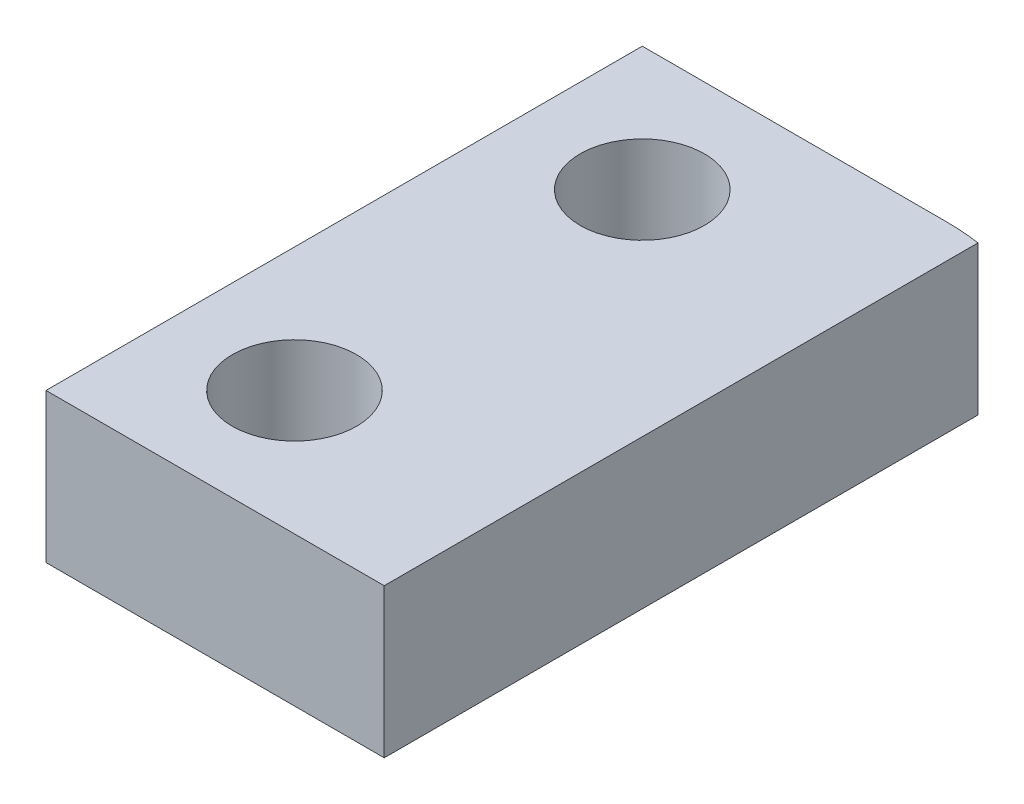
ISO-10303-21;
HEADER;
FILE_DESCRIPTION(('STEP AP214'),'2;1');
FILE_NAME('part.step','',(''),(''),'','','');
FILE_SCHEMA(('AUTOMOTIVE_DESIGN { 1 0 10303 214 1 1 1 1 }'));
ENDSEC;
DATA;
#1=APPLICATION_CONTEXT('core data for automotive mechanical design processes');
#2=APPLICATION_PROTOCOL_DEFINITION('international standard','automotive_design',2000,#1);
#3=PRODUCT_CONTEXT('',#1,'mechanical');
#4=PRODUCT('Part','Part','',(#3));
#5=PRODUCT_RELATED_PRODUCT_CATEGORY('part','',(#4));
#6=PRODUCT_DEFINITION_FORMATION('','',#4);
#7=PRODUCT_DEFINITION_CONTEXT('part definition',#1,'design');
#8=PRODUCT_DEFINITION('design','',#6,#7);
#9=PRODUCT_DEFINITION_SHAPE('','',#8);
#10=(LENGTH_UNIT() NAMED_UNIT(*) SI_UNIT(.MILLI.,.METRE.));
#11=(NAMED_UNIT(*) PLANE_ANGLE_UNIT() SI_UNIT($,.RADIAN.));
#12=(NAMED_UNIT(*) SI_UNIT($,.STERADIAN.) SOLID_ANGLE_UNIT());
#13=UNCERTAINTY_MEASURE_WITH_UNIT(LENGTH_MEASURE(1.E-05),#10,'distance_accuracy_value','');
#14=(GEOMETRIC_REPRESENTATION_CONTEXT(3) GLOBAL_UNCERTAINTY_ASSIGNED_CONTEXT((#13)) GLOBAL_UNIT_ASSIGNED_CONTEXT((#10,
#11,#12)) REPRESENTATION_CONTEXT('',''));
#15=CARTESIAN_POINT('',(0.,0.,0.));
#16=DIRECTION('',(0.,0.,1.));
#17=DIRECTION('',(1.,0.,0.));
#18=AXIS2_PLACEMENT_3D('',#15,#16,#17);
#19=CARTESIAN_POINT('',(20.,3.,6.));
#20=DIRECTION('',(0.,0.,-1.));
#21=DIRECTION('',(-1.,0.,0.));
#22=AXIS2_PLACEMENT_3D('',#19,#20,#21);
#23=PLANE('',#22);
#24=DIRECTION('',(1.,0.,0.));
#25=VECTOR('',#24,1.);
#26=CARTESIAN_POINT('',(20.,0.,6.));
#27=LINE('',#26,#25);
#28=CARTESIAN_POINT('',(-20.,0.,6.));
#29=VERTEX_POINT('',#28);
#30=CARTESIAN_POINT('',(-13.193669780394,0.,6.));
#31=VERTEX_POINT('',#30);
#32=EDGE_CURVE('E122',#29,#31,#27,.T.);
#33=ORIENTED_EDGE('',*,*,#32,.T.);
#34=DIRECTION('',(0.,1.,0.));
#35=VECTOR('',#34,1.);
#36=CARTESIAN_POINT('',(-13.193669780394,3.,6.));
#37=LINE('',#36,#35);
#38=CARTESIAN_POINT('',(-13.193669780394,3.,6.));
#39=VERTEX_POINT('',#38);
#40=EDGE_CURVE('E155',#31,#39,#37,.T.);
#41=ORIENTED_EDGE('',*,*,#40,.T.);
#42=DIRECTION('',(1.,0.,0.));
#43=VECTOR('',#42,1.);
#44=CARTESIAN_POINT('',(20.,3.,6.));
#45=LINE('',#44,#43);
#46=CARTESIAN_POINT('',(-20.,3.,6.));
#47=VERTEX_POINT('',#46);
#48=EDGE_CURVE('E97',#47,#39,#45,.T.);
#49=ORIENTED_EDGE('',*,*,#48,.F.);
#50=DIRECTION('',(0.,-1.,0.));
#51=VECTOR('',#50,1.);
#52=CARTESIAN_POINT('',(-20.,3.,6.));
#53=LINE('',#52,#51);
#54=EDGE_CURVE('E101',#47,#29,#53,.T.);
#55=ORIENTED_EDGE('',*,*,#54,.T.);
#56=EDGE_LOOP('',(#33,#41,#49,#55));
#57=FACE_BOUND('',#56,.T.);
#58=ADVANCED_FACE('F38',(#57),#23,.F.);
#59=CARTESIAN_POINT('',(-20.,3.,6.));
#60=DIRECTION('',(1.,0.,0.));
#61=DIRECTION('',(0.,0.,-1.));
#62=AXIS2_PLACEMENT_3D('',#59,#60,#61);
#63=PLANE('',#62);
#64=DIRECTION('',(0.,0.,1.));
#65=VECTOR('',#64,1.);
#66=CARTESIAN_POINT('',(-20.,0.,6.));
#67=LINE('',#66,#65);
#68=CARTESIAN_POINT('',(-20.,0.,-6.));
#69=VERTEX_POINT('',#68);
#70=EDGE_CURVE('E117',#69,#29,#67,.T.);
#71=ORIENTED_EDGE('',*,*,#70,.T.);
#72=ORIENTED_EDGE('',*,*,#54,.F.);
#73=DIRECTION('',(0.,0.,1.));
#74=VECTOR('',#73,1.);
#75=CARTESIAN_POINT('',(-20.,3.,6.));
#76=LINE('',#75,#74);
#77=CARTESIAN_POINT('',(-20.,3.,-6.));
#78=VERTEX_POINT('',#77);
#79=EDGE_CURVE('E121',#78,#47,#76,.T.);
#80=ORIENTED_EDGE('',*,*,#79,.F.);
#81=DIRECTION('',(0.,-1.,0.));
#82=VECTOR('',#81,1.);
#83=CARTESIAN_POINT('',(-20.,3.,-6.));
#84=LINE('',#83,#82);
#85=EDGE_CURVE('E107',#78,#69,#84,.T.);
#86=ORIENTED_EDGE('',*,*,#85,.T.);
#87=EDGE_LOOP('',(#71,#72,#80,#86));
#88=FACE_BOUND('',#87,.T.);
#89=ADVANCED_FACE('F163',(#88),#63,.F.);
#90=CARTESIAN_POINT('',(20.,3.,-6.));
#91=DIRECTION('',(0.,0.,1.));
#92=DIRECTION('',(1.,0.,0.));
#93=AXIS2_PLACEMENT_3D('',#90,#91,#92);
#94=PLANE('',#93);
#95=DIRECTION('',(-1.,0.,0.));
#96=VECTOR('',#95,1.);
#97=CARTESIAN_POINT('',(20.,3.,-6.));
#98=LINE('',#97,#96);
#99=CARTESIAN_POINT('',(-13.9029952942542,3.,-6.));
#100=VERTEX_POINT('',#99);
#101=EDGE_CURVE('E130',#100,#78,#98,.T.);
#102=ORIENTED_EDGE('',*,*,#101,.F.);
#103=DIRECTION('',(0.,1.,0.));
#104=VECTOR('',#103,1.);
#105=CARTESIAN_POINT('',(-13.9029952942542,3.,-6.));
#106=LINE('',#105,#104);
#107=CARTESIAN_POINT('',(-13.9029952942542,0.,-6.));
#108=VERTEX_POINT('',#107);
#109=EDGE_CURVE('E61',#100,#108,#106,.F.);
#110=ORIENTED_EDGE('',*,*,#109,.T.);
#111=DIRECTION('',(-1.,0.,0.));
#112=VECTOR('',#111,1.);
#113=CARTESIAN_POINT('',(20.,0.,-6.));
#114=LINE('',#113,#112);
#115=EDGE_CURVE('E115',#108,#69,#114,.T.);
#116=ORIENTED_EDGE('',*,*,#115,.T.);
#117=ORIENTED_EDGE('',*,*,#85,.F.);
#118=EDGE_LOOP('',(#102,#110,#116,#117));
#119=FACE_BOUND('',#118,.T.);
#120=ADVANCED_FACE('F165',(#119),#94,.F.);
#121=CARTESIAN_POINT('',(0.,3.,0.));
#122=DIRECTION('',(0.,1.,0.));
#123=DIRECTION('',(0.,0.,1.));
#124=AXIS2_PLACEMENT_3D('',#121,#122,#123);
#125=PLANE('',#124);
#126=DIRECTION('',(0.,0.,1.));
#127=VECTOR('',#126,1.);
#128=CARTESIAN_POINT('',(-13.193669780394,3.,-9.57366064560006));
#129=LINE('',#128,#127);
#130=CARTESIAN_POINT('',(-13.193669780394,3.,-5.94942999903898));
#131=VERTEX_POINT('',#130);
#132=EDGE_CURVE('E85',#131,#39,#129,.T.);
#133=ORIENTED_EDGE('',*,*,#132,.F.);
#134=CARTESIAN_POINT('',(-13.9029952942542,3.,-0.999999999999998));
#135=DIRECTION('',(0.,1.,0.));
#136=DIRECTION('',(0.,0.,1.));
#137=AXIS2_PLACEMENT_3D('',#134,#135,#136);
#138=CIRCLE('',#137,5.);
#139=EDGE_CURVE('E95',#131,#100,#138,.T.);
#140=ORIENTED_EDGE('',*,*,#139,.T.);
#141=ORIENTED_EDGE('',*,*,#101,.T.);
#142=ORIENTED_EDGE('',*,*,#79,.T.);
#143=ORIENTED_EDGE('',*,*,#48,.T.);
#144=EDGE_LOOP('',(#133,#140,#141,#142,#143));
#145=FACE_BOUND('',#144,.T.);
#146=CARTESIAN_POINT('',(-17.5,3.,3.5));
#147=DIRECTION('',(0.,1.,0.));
#148=DIRECTION('',(0.,0.,1.));
#149=AXIS2_PLACEMENT_3D('',#146,#147,#148);
#150=CIRCLE('',#149,1.25);
#151=CARTESIAN_POINT('',(-17.5,3.,4.75));
#152=VERTEX_POINT('',#151);
#153=EDGE_CURVE('E151',#152,#152,#150,.T.);
#154=ORIENTED_EDGE('',*,*,#153,.F.);
#155=EDGE_LOOP('',(#154));
#156=FACE_BOUND('',#155,.T.);
#157=CARTESIAN_POINT('',(-17.5,3.,-3.5));
#158=DIRECTION('',(0.,1.,0.));
#159=DIRECTION('',(0.,0.,1.));
#160=AXIS2_PLACEMENT_3D('',#157,#158,#159);
#161=CIRCLE('',#160,1.25);
#162=CARTESIAN_POINT('',(-17.5,3.,-2.25));
#163=VERTEX_POINT('',#162);
#164=EDGE_CURVE('E142',#163,#163,#161,.T.);
#165=ORIENTED_EDGE('',*,*,#164,.F.);
#166=EDGE_LOOP('',(#165));
#167=FACE_BOUND('',#166,.T.);
#168=ADVANCED_FACE('F93',(#145,#156,#167),#125,.T.);
#169=CARTESIAN_POINT('',(0.,0.,0.));
#170=DIRECTION('',(0.,1.,0.));
#171=DIRECTION('',(0.,0.,1.));
#172=AXIS2_PLACEMENT_3D('',#169,#170,#171);
#173=PLANE('',#172);
#174=CARTESIAN_POINT('',(-17.5,0.,3.5));
#175=DIRECTION('',(0.,1.,0.));
#176=DIRECTION('',(0.,0.,1.));
#177=AXIS2_PLACEMENT_3D('',#174,#175,#176);
#178=CIRCLE('',#177,1.25);
#179=CARTESIAN_POINT('',(-17.5,0.,4.75));
#180=VERTEX_POINT('',#179);
#181=EDGE_CURVE('E148',#180,#180,#178,.T.);
#182=ORIENTED_EDGE('',*,*,#181,.T.);
#183=EDGE_LOOP('',(#182));
#184=FACE_BOUND('',#183,.T.);
#185=CARTESIAN_POINT('',(-17.5,0.,-3.5));
#186=DIRECTION('',(0.,1.,0.));
#187=DIRECTION('',(0.,0.,1.));
#188=AXIS2_PLACEMENT_3D('',#185,#186,#187);
#189=CIRCLE('',#188,1.25);
#190=CARTESIAN_POINT('',(-17.5,0.,-2.25));
#191=VERTEX_POINT('',#190);
#192=EDGE_CURVE('E138',#191,#191,#189,.T.);
#193=ORIENTED_EDGE('',*,*,#192,.T.);
#194=EDGE_LOOP('',(#193));
#195=FACE_BOUND('',#194,.T.);
#196=CARTESIAN_POINT('',(-13.9029952942542,0.,-0.999999999999998));
#197=DIRECTION('',(0.,1.,0.));
#198=DIRECTION('',(0.,0.,1.));
#199=AXIS2_PLACEMENT_3D('',#196,#197,#198);
#200=CIRCLE('',#199,5.);
#201=CARTESIAN_POINT('',(-13.193669780394,0.,-5.94942999903898));
#202=VERTEX_POINT('',#201);
#203=EDGE_CURVE('E47',#108,#202,#200,.F.);
#204=ORIENTED_EDGE('',*,*,#203,.T.);
#205=DIRECTION('',(0.,0.,1.));
#206=VECTOR('',#205,1.);
#207=CARTESIAN_POINT('',(-13.193669780394,0.,0.));
#208=LINE('',#207,#206);
#209=EDGE_CURVE('E53',#202,#31,#208,.T.);
#210=ORIENTED_EDGE('',*,*,#209,.T.);
#211=ORIENTED_EDGE('',*,*,#32,.F.);
#212=ORIENTED_EDGE('',*,*,#70,.F.);
#213=ORIENTED_EDGE('',*,*,#115,.F.);
#214=EDGE_LOOP('',(#204,#210,#211,#212,#213));
#215=FACE_BOUND('',#214,.T.);
#216=ADVANCED_FACE('F112',(#184,#195,#215),#173,.F.);
#217=CARTESIAN_POINT('',(-17.5,0.,-3.5));
#218=DIRECTION('',(0.,1.,0.));
#219=DIRECTION('',(0.,0.,1.));
#220=AXIS2_PLACEMENT_3D('',#217,#218,#219);
#221=CYLINDRICAL_SURFACE('',#220,1.25);
#222=ORIENTED_EDGE('',*,*,#192,.F.);
#223=EDGE_LOOP('',(#222));
#224=FACE_BOUND('',#223,.T.);
#225=ORIENTED_EDGE('',*,*,#164,.T.);
#226=EDGE_LOOP('',(#225));
#227=FACE_BOUND('',#226,.T.);
#228=ADVANCED_FACE('F176',(#224,#227),#221,.F.);
#229=CARTESIAN_POINT('',(-17.5,0.,3.5));
#230=DIRECTION('',(0.,1.,0.));
#231=DIRECTION('',(0.,0.,1.));
#232=AXIS2_PLACEMENT_3D('',#229,#230,#231);
#233=CYLINDRICAL_SURFACE('',#232,1.25);
#234=ORIENTED_EDGE('',*,*,#181,.F.);
#235=EDGE_LOOP('',(#234));
#236=FACE_BOUND('',#235,.T.);
#237=ORIENTED_EDGE('',*,*,#153,.T.);
#238=EDGE_LOOP('',(#237));
#239=FACE_BOUND('',#238,.T.);
#240=ADVANCED_FACE('F182',(#236,#239),#233,.F.);
#241=CARTESIAN_POINT('',(-13.9029952942542,-7.,-0.999999999999998));
#242=DIRECTION('',(0.,1.,0.));
#243=DIRECTION('',(0.,0.,1.));
#244=AXIS2_PLACEMENT_3D('',#241,#242,#243);
#245=CYLINDRICAL_SURFACE('',#244,5.);
#246=DIRECTION('',(0.,1.,0.));
#247=VECTOR('',#246,1.);
#248=CARTESIAN_POINT('',(-13.193669780394,-7.,-5.94942999903898));
#249=LINE('',#248,#247);
#250=EDGE_CURVE('E11',#202,#131,#249,.T.);
#251=ORIENTED_EDGE('',*,*,#250,.F.);
#252=ORIENTED_EDGE('',*,*,#203,.F.);
#253=ORIENTED_EDGE('',*,*,#109,.F.);
#254=ORIENTED_EDGE('',*,*,#139,.F.);
#255=EDGE_LOOP('',(#251,#252,#253,#254));
#256=FACE_BOUND('',#255,.T.);
#257=ADVANCED_FACE('F40',(#256),#245,.T.);
#258=CARTESIAN_POINT('',(-13.193669780394,-7.,-9.57366064560006));
#259=DIRECTION('',(-1.,0.,0.));
#260=DIRECTION('',(0.,0.,1.));
#261=AXIS2_PLACEMENT_3D('',#258,#259,#260);
#262=PLANE('',#261);
#263=ORIENTED_EDGE('',*,*,#209,.F.);
#264=ORIENTED_EDGE('',*,*,#250,.T.);
#265=ORIENTED_EDGE('',*,*,#132,.T.);
#266=ORIENTED_EDGE('',*,*,#40,.F.);
#267=EDGE_LOOP('',(#263,#264,#265,#266));
#268=FACE_BOUND('',#267,.T.);
#269=ADVANCED_FACE('F84',(#268),#262,.F.);
#270=CLOSED_SHELL('',(#58,#89,#120,#168,#216,#228,#240,#257,#269));
#271=MANIFOLD_SOLID_BREP('B2',#270);
#272=ADVANCED_BREP_SHAPE_REPRESENTATION('',(#18,#271),#14);
#273=SHAPE_DEFINITION_REPRESENTATION(#9,#272);
ENDSEC;
END-ISO-10303-21;
